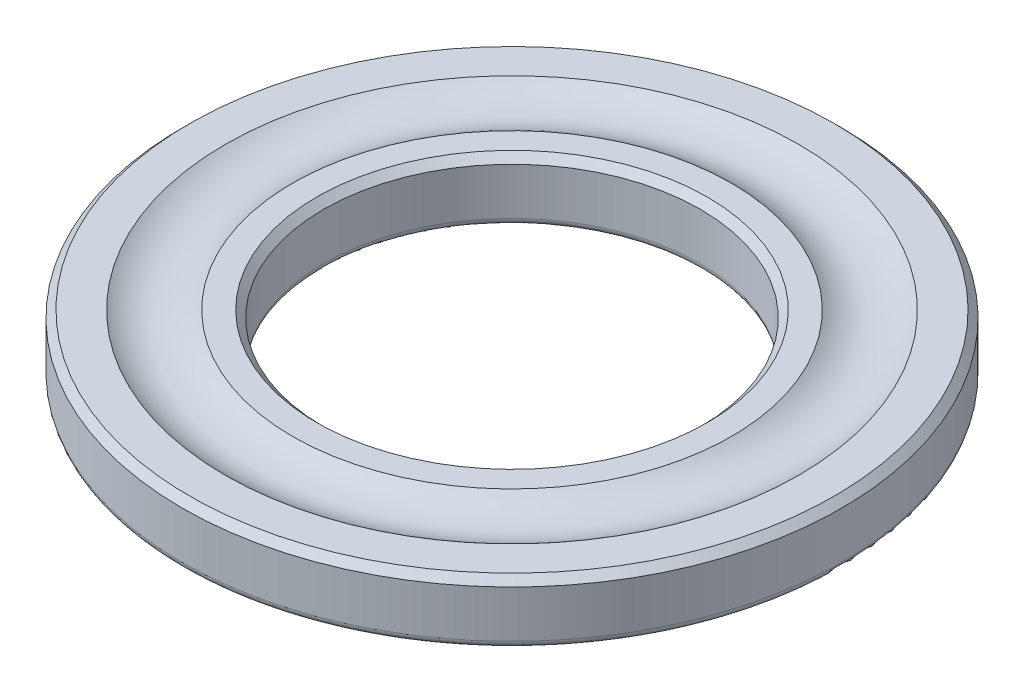
ISO-10303-21;
HEADER;
FILE_DESCRIPTION(('STEP AP214'),'2;1');
FILE_NAME('part.step','',(''),(''),'','','');
FILE_SCHEMA(('AUTOMOTIVE_DESIGN { 1 0 10303 214 1 1 1 1 }'));
ENDSEC;
DATA;
#1=APPLICATION_CONTEXT('core data for automotive mechanical design processes');
#2=APPLICATION_PROTOCOL_DEFINITION('international standard','automotive_design',2000,#1);
#3=PRODUCT_CONTEXT('',#1,'mechanical');
#4=PRODUCT('Part','Part','',(#3));
#5=PRODUCT_RELATED_PRODUCT_CATEGORY('part','',(#4));
#6=PRODUCT_DEFINITION_FORMATION('','',#4);
#7=PRODUCT_DEFINITION_CONTEXT('part definition',#1,'design');
#8=PRODUCT_DEFINITION('design','',#6,#7);
#9=PRODUCT_DEFINITION_SHAPE('','',#8);
#10=(LENGTH_UNIT() NAMED_UNIT(*) SI_UNIT(.MILLI.,.METRE.));
#11=(NAMED_UNIT(*) PLANE_ANGLE_UNIT() SI_UNIT($,.RADIAN.));
#12=(NAMED_UNIT(*) SI_UNIT($,.STERADIAN.) SOLID_ANGLE_UNIT());
#13=UNCERTAINTY_MEASURE_WITH_UNIT(LENGTH_MEASURE(1.E-05),#10,'distance_accuracy_value','');
#14=(GEOMETRIC_REPRESENTATION_CONTEXT(3) GLOBAL_UNCERTAINTY_ASSIGNED_CONTEXT((#13)) GLOBAL_UNIT_ASSIGNED_CONTEXT((#10,
#11,#12)) REPRESENTATION_CONTEXT('',''));
#15=CARTESIAN_POINT('',(0.,0.,0.));
#16=DIRECTION('',(0.,0.,1.));
#17=DIRECTION('',(1.,0.,0.));
#18=AXIS2_PLACEMENT_3D('',#15,#16,#17);
#19=CARTESIAN_POINT('',(0.,0.3,0.));
#20=DIRECTION('',(0.,-1.,0.));
#21=DIRECTION('',(0.,0.,-1.));
#22=AXIS2_PLACEMENT_3D('',#19,#20,#21);
#23=TOROIDAL_SURFACE('',#22,13.7,0.3);
#24=CARTESIAN_POINT('',(0.,0.3,0.));
#25=DIRECTION('',(0.,-1.,0.));
#26=DIRECTION('',(0.,0.,-1.));
#27=AXIS2_PLACEMENT_3D('',#24,#25,#26);
#28=CIRCLE('',#27,14.);
#29=CARTESIAN_POINT('',(0.,0.3,-14.));
#30=VERTEX_POINT('',#29);
#31=EDGE_CURVE('E9',#30,#30,#28,.T.);
#32=ORIENTED_EDGE('',*,*,#31,.T.);
#33=EDGE_LOOP('',(#32));
#34=FACE_BOUND('',#33,.T.);
#35=CARTESIAN_POINT('',(0.,0.,0.));
#36=DIRECTION('',(0.,-1.,0.));
#37=DIRECTION('',(0.,0.,-1.));
#38=AXIS2_PLACEMENT_3D('',#35,#36,#37);
#39=CIRCLE('',#38,13.7);
#40=CARTESIAN_POINT('',(0.,0.,-13.7));
#41=VERTEX_POINT('',#40);
#42=EDGE_CURVE('E63',#41,#41,#39,.T.);
#43=ORIENTED_EDGE('',*,*,#42,.F.);
#44=EDGE_LOOP('',(#43));
#45=FACE_BOUND('',#44,.T.);
#46=ADVANCED_FACE('F13',(#34,#45),#23,.T.);
#47=CARTESIAN_POINT('',(0.,0.,0.));
#48=DIRECTION('',(0.,-1.,0.));
#49=DIRECTION('',(0.,0.,-1.));
#50=AXIS2_PLACEMENT_3D('',#47,#48,#49);
#51=CYLINDRICAL_SURFACE('',#50,14.);
#52=CARTESIAN_POINT('',(0.,2.2952,0.));
#53=DIRECTION('',(0.,-1.,0.));
#54=DIRECTION('',(0.,0.,-1.));
#55=AXIS2_PLACEMENT_3D('',#52,#53,#54);
#56=CIRCLE('',#55,14.);
#57=CARTESIAN_POINT('',(0.,2.2952,-14.));
#58=VERTEX_POINT('',#57);
#59=EDGE_CURVE('E20',#58,#58,#56,.T.);
#60=ORIENTED_EDGE('',*,*,#59,.T.);
#61=EDGE_LOOP('',(#60));
#62=FACE_BOUND('',#61,.T.);
#63=ORIENTED_EDGE('',*,*,#31,.F.);
#64=EDGE_LOOP('',(#63));
#65=FACE_BOUND('',#64,.T.);
#66=ADVANCED_FACE('F72',(#62,#65),#51,.T.);
#67=CARTESIAN_POINT('',(0.,2.5952,0.));
#68=DIRECTION('',(0.,-1.,0.));
#69=DIRECTION('',(0.,0.,-1.));
#70=AXIS2_PLACEMENT_3D('',#67,#68,#69);
#71=CONICAL_SURFACE('',#70,13.7,0.785398163397448);
#72=ORIENTED_EDGE('',*,*,#59,.F.);
#73=EDGE_LOOP('',(#72));
#74=FACE_BOUND('',#73,.T.);
#75=CARTESIAN_POINT('',(0.,2.5952,0.));
#76=DIRECTION('',(0.,-1.,0.));
#77=DIRECTION('',(0.,0.,-1.));
#78=AXIS2_PLACEMENT_3D('',#75,#76,#77);
#79=CIRCLE('',#78,13.7);
#80=CARTESIAN_POINT('',(0.,2.5952,-13.7));
#81=VERTEX_POINT('',#80);
#82=EDGE_CURVE('E29',#81,#81,#79,.T.);
#83=ORIENTED_EDGE('',*,*,#82,.T.);
#84=EDGE_LOOP('',(#83));
#85=FACE_BOUND('',#84,.T.);
#86=ADVANCED_FACE('F77',(#74,#85),#71,.T.);
#87=CARTESIAN_POINT('',(12.1786,2.5952,0.));
#88=DIRECTION('',(0.,-1.,0.));
#89=DIRECTION('',(0.,0.,-1.));
#90=AXIS2_PLACEMENT_3D('',#87,#88,#89);
#91=PLANE('',#90);
#92=ORIENTED_EDGE('',*,*,#82,.F.);
#93=EDGE_LOOP('',(#92));
#94=FACE_BOUND('',#93,.T.);
#95=CARTESIAN_POINT('',(0.,2.5952,0.));
#96=DIRECTION('',(0.,-1.,0.));
#97=DIRECTION('',(0.,0.,-1.));
#98=AXIS2_PLACEMENT_3D('',#95,#96,#97);
#99=CIRCLE('',#98,12.1786);
#100=CARTESIAN_POINT('',(0.,2.5952,-12.1786));
#101=VERTEX_POINT('',#100);
#102=EDGE_CURVE('E37',#101,#101,#99,.T.);
#103=ORIENTED_EDGE('',*,*,#102,.T.);
#104=EDGE_LOOP('',(#103));
#105=FACE_BOUND('',#104,.T.);
#106=ADVANCED_FACE('F81',(#94,#105),#91,.F.);
#107=CARTESIAN_POINT('',(0.,4.5,0.));
#108=DIRECTION('',(0.,-1.,0.));
#109=DIRECTION('',(0.,0.,-1.));
#110=AXIS2_PLACEMENT_3D('',#107,#108,#109);
#111=TOROIDAL_SURFACE('',#110,10.75,2.381);
#112=ORIENTED_EDGE('',*,*,#102,.F.);
#113=EDGE_LOOP('',(#112));
#114=FACE_BOUND('',#113,.T.);
#115=CARTESIAN_POINT('',(0.,2.5952,0.));
#116=DIRECTION('',(0.,-1.,0.));
#117=DIRECTION('',(0.,0.,-1.));
#118=AXIS2_PLACEMENT_3D('',#115,#116,#117);
#119=CIRCLE('',#118,9.3214);
#120=CARTESIAN_POINT('',(0.,2.5952,-9.3214));
#121=VERTEX_POINT('',#120);
#122=EDGE_CURVE('E43',#121,#121,#119,.T.);
#123=ORIENTED_EDGE('',*,*,#122,.T.);
#124=EDGE_LOOP('',(#123));
#125=FACE_BOUND('',#124,.T.);
#126=ADVANCED_FACE('F88',(#114,#125),#111,.F.);
#127=CARTESIAN_POINT('',(8.3,2.5952,0.));
#128=DIRECTION('',(0.,-1.,0.));
#129=DIRECTION('',(0.,0.,-1.));
#130=AXIS2_PLACEMENT_3D('',#127,#128,#129);
#131=PLANE('',#130);
#132=ORIENTED_EDGE('',*,*,#122,.F.);
#133=EDGE_LOOP('',(#132));
#134=FACE_BOUND('',#133,.T.);
#135=CARTESIAN_POINT('',(0.,2.5952,0.));
#136=DIRECTION('',(0.,-1.,0.));
#137=DIRECTION('',(0.,0.,-1.));
#138=AXIS2_PLACEMENT_3D('',#135,#136,#137);
#139=CIRCLE('',#138,8.3);
#140=CARTESIAN_POINT('',(0.,2.5952,-8.3));
#141=VERTEX_POINT('',#140);
#142=EDGE_CURVE('E47',#141,#141,#139,.T.);
#143=ORIENTED_EDGE('',*,*,#142,.T.);
#144=EDGE_LOOP('',(#143));
#145=FACE_BOUND('',#144,.T.);
#146=ADVANCED_FACE('F92',(#134,#145),#131,.F.);
#147=CARTESIAN_POINT('',(0.,2.2952,0.));
#148=DIRECTION('',(0.,1.,0.));
#149=DIRECTION('',(0.,0.,1.));
#150=AXIS2_PLACEMENT_3D('',#147,#148,#149);
#151=CONICAL_SURFACE('',#150,8.,0.785398163397448);
#152=ORIENTED_EDGE('',*,*,#142,.F.);
#153=EDGE_LOOP('',(#152));
#154=FACE_BOUND('',#153,.T.);
#155=CARTESIAN_POINT('',(0.,2.2952,0.));
#156=DIRECTION('',(0.,-1.,0.));
#157=DIRECTION('',(0.,0.,-1.));
#158=AXIS2_PLACEMENT_3D('',#155,#156,#157);
#159=CIRCLE('',#158,8.);
#160=CARTESIAN_POINT('',(0.,2.2952,-8.));
#161=VERTEX_POINT('',#160);
#162=EDGE_CURVE('E51',#161,#161,#159,.T.);
#163=ORIENTED_EDGE('',*,*,#162,.T.);
#164=EDGE_LOOP('',(#163));
#165=FACE_BOUND('',#164,.T.);
#166=ADVANCED_FACE('F96',(#154,#165),#151,.F.);
#167=CARTESIAN_POINT('',(0.,0.,0.));
#168=DIRECTION('',(0.,-1.,0.));
#169=DIRECTION('',(0.,0.,-1.));
#170=AXIS2_PLACEMENT_3D('',#167,#168,#169);
#171=CYLINDRICAL_SURFACE('',#170,8.);
#172=ORIENTED_EDGE('',*,*,#162,.F.);
#173=EDGE_LOOP('',(#172));
#174=FACE_BOUND('',#173,.T.);
#175=CARTESIAN_POINT('',(0.,0.3,0.));
#176=DIRECTION('',(0.,-1.,0.));
#177=DIRECTION('',(0.,0.,-1.));
#178=AXIS2_PLACEMENT_3D('',#175,#176,#177);
#179=CIRCLE('',#178,8.);
#180=CARTESIAN_POINT('',(0.,0.3,-8.));
#181=VERTEX_POINT('',#180);
#182=EDGE_CURVE('E55',#181,#181,#179,.T.);
#183=ORIENTED_EDGE('',*,*,#182,.T.);
#184=EDGE_LOOP('',(#183));
#185=FACE_BOUND('',#184,.T.);
#186=ADVANCED_FACE('F100',(#174,#185),#171,.F.);
#187=CARTESIAN_POINT('',(0.,0.3,0.));
#188=DIRECTION('',(0.,-1.,0.));
#189=DIRECTION('',(0.,0.,-1.));
#190=AXIS2_PLACEMENT_3D('',#187,#188,#189);
#191=TOROIDAL_SURFACE('',#190,8.3,0.3);
#192=CARTESIAN_POINT('',(0.,0.,0.));
#193=DIRECTION('',(0.,-1.,0.));
#194=DIRECTION('',(0.,0.,-1.));
#195=AXIS2_PLACEMENT_3D('',#192,#193,#194);
#196=CIRCLE('',#195,8.3);
#197=CARTESIAN_POINT('',(0.,0.,-8.3));
#198=VERTEX_POINT('',#197);
#199=EDGE_CURVE('E59',#198,#198,#196,.T.);
#200=ORIENTED_EDGE('',*,*,#199,.T.);
#201=EDGE_LOOP('',(#200));
#202=FACE_BOUND('',#201,.T.);
#203=ORIENTED_EDGE('',*,*,#182,.F.);
#204=EDGE_LOOP('',(#203));
#205=FACE_BOUND('',#204,.T.);
#206=ADVANCED_FACE('F104',(#202,#205),#191,.T.);
#207=CARTESIAN_POINT('',(8.3,0.,0.));
#208=DIRECTION('',(0.,-1.,0.));
#209=DIRECTION('',(0.,0.,-1.));
#210=AXIS2_PLACEMENT_3D('',#207,#208,#209);
#211=PLANE('',#210);
#212=ORIENTED_EDGE('',*,*,#42,.T.);
#213=EDGE_LOOP('',(#212));
#214=FACE_BOUND('',#213,.T.);
#215=ORIENTED_EDGE('',*,*,#199,.F.);
#216=EDGE_LOOP('',(#215));
#217=FACE_BOUND('',#216,.T.);
#218=ADVANCED_FACE('F68',(#214,#217),#211,.T.);
#219=CLOSED_SHELL('',(#46,#66,#86,#106,#126,#146,#166,#186,#206,#218));
#220=MANIFOLD_SOLID_BREP('B1',#219);
#221=ADVANCED_BREP_SHAPE_REPRESENTATION('',(#18,#220),#14);
#222=SHAPE_DEFINITION_REPRESENTATION(#9,#221);
ENDSEC;
END-ISO-10303-21;
